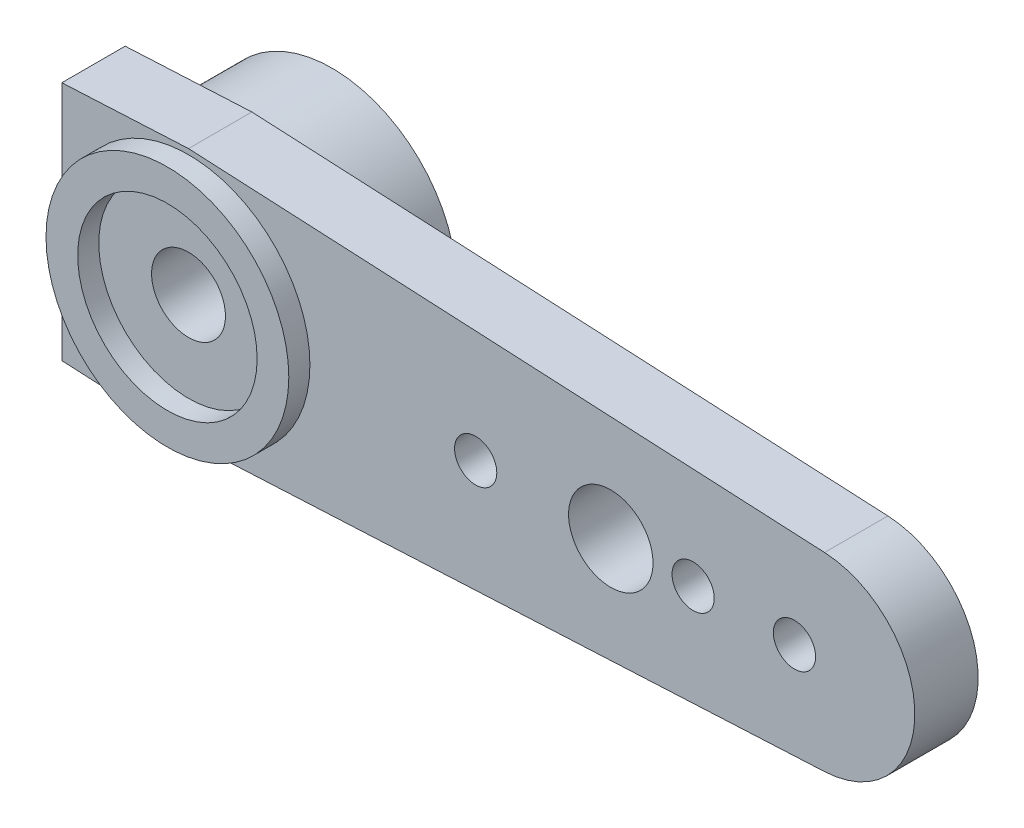
ISO-10303-21;
HEADER;
FILE_DESCRIPTION(('STEP AP214'),'2;1');
FILE_NAME('part.step','',(''),(''),'','','');
FILE_SCHEMA(('AUTOMOTIVE_DESIGN { 1 0 10303 214 1 1 1 1 }'));
ENDSEC;
DATA;
#1=APPLICATION_CONTEXT('core data for automotive mechanical design processes');
#2=APPLICATION_PROTOCOL_DEFINITION('international standard','automotive_design',2000,#1);
#3=PRODUCT_CONTEXT('',#1,'mechanical');
#4=PRODUCT('Part','Part','',(#3));
#5=PRODUCT_RELATED_PRODUCT_CATEGORY('part','',(#4));
#6=PRODUCT_DEFINITION_FORMATION('','',#4);
#7=PRODUCT_DEFINITION_CONTEXT('part definition',#1,'design');
#8=PRODUCT_DEFINITION('design','',#6,#7);
#9=PRODUCT_DEFINITION_SHAPE('','',#8);
#10=(LENGTH_UNIT() NAMED_UNIT(*) SI_UNIT(.MILLI.,.METRE.));
#11=(NAMED_UNIT(*) PLANE_ANGLE_UNIT() SI_UNIT($,.RADIAN.));
#12=(NAMED_UNIT(*) SI_UNIT($,.STERADIAN.) SOLID_ANGLE_UNIT());
#13=UNCERTAINTY_MEASURE_WITH_UNIT(LENGTH_MEASURE(1.E-05),#10,'distance_accuracy_value','');
#14=(GEOMETRIC_REPRESENTATION_CONTEXT(3) GLOBAL_UNCERTAINTY_ASSIGNED_CONTEXT((#13)) GLOBAL_UNIT_ASSIGNED_CONTEXT((#10,
#11,#12)) REPRESENTATION_CONTEXT('',''));
#15=CARTESIAN_POINT('',(0.,0.,0.));
#16=DIRECTION('',(0.,0.,1.));
#17=DIRECTION('',(1.,0.,0.));
#18=AXIS2_PLACEMENT_3D('',#15,#16,#17);
#19=CARTESIAN_POINT('',(14.95,0.,3.4));
#20=DIRECTION('',(0.,0.,1.));
#21=DIRECTION('',(1.,0.,0.));
#22=AXIS2_PLACEMENT_3D('',#19,#20,#21);
#23=PLANE('',#22);
#24=CARTESIAN_POINT('',(0.,0.,3.4));
#25=DIRECTION('',(0.,0.,1.));
#26=DIRECTION('',(1.,0.,0.));
#27=AXIS2_PLACEMENT_3D('',#24,#25,#26);
#28=CIRCLE('',#27,0.875);
#29=CARTESIAN_POINT('',(0.875,0.,3.4));
#30=VERTEX_POINT('',#29);
#31=EDGE_CURVE('E119',#30,#30,#28,.T.);
#32=ORIENTED_EDGE('',*,*,#31,.F.);
#33=EDGE_LOOP('',(#32));
#34=FACE_BOUND('',#33,.T.);
#35=CARTESIAN_POINT('',(0.,0.,3.4));
#36=DIRECTION('',(0.,0.,1.));
#37=DIRECTION('',(1.,0.,0.));
#38=AXIS2_PLACEMENT_3D('',#35,#36,#37);
#39=CIRCLE('',#38,2.125);
#40=CARTESIAN_POINT('',(2.125,0.,3.4));
#41=VERTEX_POINT('',#40);
#42=EDGE_CURVE('E40',#41,#41,#39,.F.);
#43=ORIENTED_EDGE('',*,*,#42,.F.);
#44=EDGE_LOOP('',(#43));
#45=FACE_BOUND('',#44,.T.);
#46=ADVANCED_FACE('F32',(#34,#45),#23,.T.);
#47=CARTESIAN_POINT('',(0.,0.,0.));
#48=DIRECTION('',(0.,0.,1.));
#49=DIRECTION('',(1.,0.,0.));
#50=AXIS2_PLACEMENT_3D('',#47,#48,#49);
#51=PLANE('',#50);
#52=CARTESIAN_POINT('',(0.,0.,0.));
#53=DIRECTION('',(0.,0.,1.));
#54=DIRECTION('',(1.,0.,0.));
#55=AXIS2_PLACEMENT_3D('',#52,#53,#54);
#56=CIRCLE('',#55,2.95);
#57=CARTESIAN_POINT('',(-2.95,0.,0.));
#58=VERTEX_POINT('',#57);
#59=EDGE_CURVE('E141',#58,#58,#56,.T.);
#60=ORIENTED_EDGE('',*,*,#59,.F.);
#61=EDGE_LOOP('',(#60));
#62=FACE_BOUND('',#61,.T.);
#63=CARTESIAN_POINT('',(0.,0.,0.));
#64=DIRECTION('',(0.,0.,1.));
#65=DIRECTION('',(1.,0.,0.));
#66=AXIS2_PLACEMENT_3D('',#63,#64,#65);
#67=CIRCLE('',#66,2.25);
#68=CARTESIAN_POINT('',(-2.25,0.,0.));
#69=VERTEX_POINT('',#68);
#70=EDGE_CURVE('E138',#69,#69,#67,.T.);
#71=ORIENTED_EDGE('',*,*,#70,.T.);
#72=EDGE_LOOP('',(#71));
#73=FACE_BOUND('',#72,.T.);
#74=ADVANCED_FACE('F216',(#62,#73),#51,.F.);
#75=CARTESIAN_POINT('',(0.,0.,1.9));
#76=DIRECTION('',(0.,0.,-1.));
#77=DIRECTION('',(-1.,0.,0.));
#78=AXIS2_PLACEMENT_3D('',#75,#76,#77);
#79=CYLINDRICAL_SURFACE('',#78,2.95);
#80=CARTESIAN_POINT('',(0.,0.,1.9));
#81=DIRECTION('',(0.,0.,1.));
#82=DIRECTION('',(1.,0.,0.));
#83=AXIS2_PLACEMENT_3D('',#80,#81,#82);
#84=CIRCLE('',#83,2.95);
#85=CARTESIAN_POINT('',(-2.95,0.,1.9));
#86=VERTEX_POINT('',#85);
#87=EDGE_CURVE('E142',#86,#86,#84,.T.);
#88=CARTESIAN_POINT('',(-2.95,0.,1.9));
#89=CARTESIAN_POINT('',(-2.95,0.,1.88020833333333));
#90=CARTESIAN_POINT('',(-2.95,0.,1.86041666666667));
#91=CARTESIAN_POINT('',(-2.95,0.,1.82083333333333));
#92=CARTESIAN_POINT('',(-2.95,0.,1.80104166666667));
#93=CARTESIAN_POINT('',(-2.95,0.,1.76145833333333));
#94=CARTESIAN_POINT('',(-2.95,0.,1.74166666666667));
#95=CARTESIAN_POINT('',(-2.95,0.,1.70208333333333));
#96=CARTESIAN_POINT('',(-2.95,0.,1.68229166666667));
#97=CARTESIAN_POINT('',(-2.95,0.,1.64270833333333));
#98=CARTESIAN_POINT('',(-2.95,0.,1.62291666666667));
#99=CARTESIAN_POINT('',(-2.95,0.,1.58333333333333));
#100=CARTESIAN_POINT('',(-2.95,0.,1.56354166666667));
#101=CARTESIAN_POINT('',(-2.95,0.,1.52395833333333));
#102=CARTESIAN_POINT('',(-2.95,0.,1.50416666666667));
#103=CARTESIAN_POINT('',(-2.95,0.,1.46458333333333));
#104=CARTESIAN_POINT('',(-2.95,0.,1.44479166666667));
#105=CARTESIAN_POINT('',(-2.95,0.,1.40520833333333));
#106=CARTESIAN_POINT('',(-2.95,0.,1.38541666666667));
#107=CARTESIAN_POINT('',(-2.95,0.,1.34583333333333));
#108=CARTESIAN_POINT('',(-2.95,0.,1.32604166666667));
#109=CARTESIAN_POINT('',(-2.95,0.,1.28645833333333));
#110=CARTESIAN_POINT('',(-2.95,0.,1.26666666666667));
#111=CARTESIAN_POINT('',(-2.95,0.,1.22708333333333));
#112=CARTESIAN_POINT('',(-2.95,0.,1.20729166666667));
#113=CARTESIAN_POINT('',(-2.95,0.,1.16770833333333));
#114=CARTESIAN_POINT('',(-2.95,0.,1.14791666666667));
#115=CARTESIAN_POINT('',(-2.95,0.,1.10833333333333));
#116=CARTESIAN_POINT('',(-2.95,0.,1.08854166666667));
#117=CARTESIAN_POINT('',(-2.95,0.,1.04895833333333));
#118=CARTESIAN_POINT('',(-2.95,0.,1.02916666666667));
#119=CARTESIAN_POINT('',(-2.95,0.,0.989583333333333));
#120=CARTESIAN_POINT('',(-2.95,0.,0.969791666666667));
#121=CARTESIAN_POINT('',(-2.95,0.,0.930208333333333));
#122=CARTESIAN_POINT('',(-2.95,0.,0.910416666666667));
#123=CARTESIAN_POINT('',(-2.95,0.,0.870833333333333));
#124=CARTESIAN_POINT('',(-2.95,0.,0.851041666666667));
#125=CARTESIAN_POINT('',(-2.95,0.,0.811458333333333));
#126=CARTESIAN_POINT('',(-2.95,0.,0.791666666666667));
#127=CARTESIAN_POINT('',(-2.95,0.,0.752083333333333));
#128=CARTESIAN_POINT('',(-2.95,0.,0.732291666666667));
#129=CARTESIAN_POINT('',(-2.95,0.,0.692708333333333));
#130=CARTESIAN_POINT('',(-2.95,0.,0.672916666666667));
#131=CARTESIAN_POINT('',(-2.95,0.,0.633333333333333));
#132=CARTESIAN_POINT('',(-2.95,0.,0.613541666666667));
#133=CARTESIAN_POINT('',(-2.95,0.,0.573958333333333));
#134=CARTESIAN_POINT('',(-2.95,0.,0.554166666666667));
#135=CARTESIAN_POINT('',(-2.95,0.,0.514583333333333));
#136=CARTESIAN_POINT('',(-2.95,0.,0.494791666666667));
#137=CARTESIAN_POINT('',(-2.95,0.,0.455208333333333));
#138=CARTESIAN_POINT('',(-2.95,0.,0.435416666666667));
#139=CARTESIAN_POINT('',(-2.95,0.,0.395833333333333));
#140=CARTESIAN_POINT('',(-2.95,0.,0.376041666666667));
#141=CARTESIAN_POINT('',(-2.95,0.,0.336458333333333));
#142=CARTESIAN_POINT('',(-2.95,0.,0.316666666666667));
#143=CARTESIAN_POINT('',(-2.95,0.,0.277083333333333));
#144=CARTESIAN_POINT('',(-2.95,0.,0.257291666666667));
#145=CARTESIAN_POINT('',(-2.95,0.,0.217708333333333));
#146=CARTESIAN_POINT('',(-2.95,0.,0.197916666666667));
#147=CARTESIAN_POINT('',(-2.95,0.,0.158333333333333));
#148=CARTESIAN_POINT('',(-2.95,0.,0.138541666666667));
#149=CARTESIAN_POINT('',(-2.95,0.,0.0989583333333333));
#150=CARTESIAN_POINT('',(-2.95,0.,0.0791666666666666));
#151=CARTESIAN_POINT('',(-2.95,0.,0.0395833333333333));
#152=CARTESIAN_POINT('',(-2.95,0.,0.0197916666666666));
#153=CARTESIAN_POINT('',(-2.95,0.,0.));
#154=B_SPLINE_CURVE_WITH_KNOTS('',3,(#88,#89,#90,#91,#92,#93,#94,#95,#96,#97,#98,#99,#100,#101,
#102,#103,#104,#105,#106,#107,#108,#109,#110,#111,#112,#113,#114,#115,#116,#117,#118,#119,#120,
#121,#122,#123,#124,#125,#126,#127,#128,#129,#130,#131,#132,#133,#134,#135,#136,#137,#138,#139,
#140,#141,#142,#143,#144,#145,#146,#147,#148,#149,#150,#151,#152,#153),.UNSPECIFIED.,.F.,.F.,(4,
2,2,2,2,2,2,2,2,2,2,2,2,2,2,2,2,2,2,2,2,2,2,2,2,2,2,2,2,2,2,2,4),(0.,0.059375,0.11875,0.178125,
0.2375,0.296875,0.35625,0.415625,0.475,0.534375,0.59375,0.653125,0.7125,0.771875,0.83125,
0.890625,0.95,1.009375,1.06875,1.128125,1.1875,1.246875,1.30625,1.365625,1.425,1.484375,1.54375,
1.603125,1.6625,1.721875,1.78125,1.840625,1.9),.UNSPECIFIED.);
#155=EDGE_CURVE('BSEAM34',#86,#58,#154,.T.);
#156=ORIENTED_EDGE('',*,*,#87,.F.);
#157=ORIENTED_EDGE('',*,*,#59,.T.);
#158=ORIENTED_EDGE('',*,*,#155,.T.);
#159=ORIENTED_EDGE('',*,*,#155,.F.);
#160=EDGE_LOOP('',(#156,#158,#157,#159));
#161=FACE_BOUND('',#160,.T.);
#162=ADVANCED_FACE('F34',(#161),#79,.T.);
#163=CARTESIAN_POINT('',(0.,0.,1.9));
#164=DIRECTION('',(0.,0.,-1.));
#165=DIRECTION('',(-1.,0.,0.));
#166=AXIS2_PLACEMENT_3D('',#163,#164,#165);
#167=CYLINDRICAL_SURFACE('',#166,2.25);
#168=CARTESIAN_POINT('',(0.,0.,1.9));
#169=DIRECTION('',(0.,0.,1.));
#170=DIRECTION('',(1.,0.,0.));
#171=AXIS2_PLACEMENT_3D('',#168,#169,#170);
#172=CIRCLE('',#171,2.25);
#173=CARTESIAN_POINT('',(-2.25,0.,1.9));
#174=VERTEX_POINT('',#173);
#175=EDGE_CURVE('E135',#174,#174,#172,.T.);
#176=CARTESIAN_POINT('',(-2.25,0.,1.9));
#177=CARTESIAN_POINT('',(-2.25,0.,1.88020833333333));
#178=CARTESIAN_POINT('',(-2.25,0.,1.86041666666667));
#179=CARTESIAN_POINT('',(-2.25,0.,1.82083333333333));
#180=CARTESIAN_POINT('',(-2.25,0.,1.80104166666667));
#181=CARTESIAN_POINT('',(-2.25,0.,1.76145833333333));
#182=CARTESIAN_POINT('',(-2.25,0.,1.74166666666667));
#183=CARTESIAN_POINT('',(-2.25,0.,1.70208333333333));
#184=CARTESIAN_POINT('',(-2.25,0.,1.68229166666667));
#185=CARTESIAN_POINT('',(-2.25,0.,1.64270833333333));
#186=CARTESIAN_POINT('',(-2.25,0.,1.62291666666667));
#187=CARTESIAN_POINT('',(-2.25,0.,1.58333333333333));
#188=CARTESIAN_POINT('',(-2.25,0.,1.56354166666667));
#189=CARTESIAN_POINT('',(-2.25,0.,1.52395833333333));
#190=CARTESIAN_POINT('',(-2.25,0.,1.50416666666667));
#191=CARTESIAN_POINT('',(-2.25,0.,1.46458333333333));
#192=CARTESIAN_POINT('',(-2.25,0.,1.44479166666667));
#193=CARTESIAN_POINT('',(-2.25,0.,1.40520833333333));
#194=CARTESIAN_POINT('',(-2.25,0.,1.38541666666667));
#195=CARTESIAN_POINT('',(-2.25,0.,1.34583333333333));
#196=CARTESIAN_POINT('',(-2.25,0.,1.32604166666667));
#197=CARTESIAN_POINT('',(-2.25,0.,1.28645833333333));
#198=CARTESIAN_POINT('',(-2.25,0.,1.26666666666667));
#199=CARTESIAN_POINT('',(-2.25,0.,1.22708333333333));
#200=CARTESIAN_POINT('',(-2.25,0.,1.20729166666667));
#201=CARTESIAN_POINT('',(-2.25,0.,1.16770833333333));
#202=CARTESIAN_POINT('',(-2.25,0.,1.14791666666667));
#203=CARTESIAN_POINT('',(-2.25,0.,1.10833333333333));
#204=CARTESIAN_POINT('',(-2.25,0.,1.08854166666667));
#205=CARTESIAN_POINT('',(-2.25,0.,1.04895833333333));
#206=CARTESIAN_POINT('',(-2.25,0.,1.02916666666667));
#207=CARTESIAN_POINT('',(-2.25,0.,0.989583333333333));
#208=CARTESIAN_POINT('',(-2.25,0.,0.969791666666667));
#209=CARTESIAN_POINT('',(-2.25,0.,0.930208333333333));
#210=CARTESIAN_POINT('',(-2.25,0.,0.910416666666667));
#211=CARTESIAN_POINT('',(-2.25,0.,0.870833333333333));
#212=CARTESIAN_POINT('',(-2.25,0.,0.851041666666667));
#213=CARTESIAN_POINT('',(-2.25,0.,0.811458333333333));
#214=CARTESIAN_POINT('',(-2.25,0.,0.791666666666667));
#215=CARTESIAN_POINT('',(-2.25,0.,0.752083333333333));
#216=CARTESIAN_POINT('',(-2.25,0.,0.732291666666667));
#217=CARTESIAN_POINT('',(-2.25,0.,0.692708333333333));
#218=CARTESIAN_POINT('',(-2.25,0.,0.672916666666667));
#219=CARTESIAN_POINT('',(-2.25,0.,0.633333333333333));
#220=CARTESIAN_POINT('',(-2.25,0.,0.613541666666667));
#221=CARTESIAN_POINT('',(-2.25,0.,0.573958333333333));
#222=CARTESIAN_POINT('',(-2.25,0.,0.554166666666667));
#223=CARTESIAN_POINT('',(-2.25,0.,0.514583333333333));
#224=CARTESIAN_POINT('',(-2.25,0.,0.494791666666667));
#225=CARTESIAN_POINT('',(-2.25,0.,0.455208333333333));
#226=CARTESIAN_POINT('',(-2.25,0.,0.435416666666667));
#227=CARTESIAN_POINT('',(-2.25,0.,0.395833333333333));
#228=CARTESIAN_POINT('',(-2.25,0.,0.376041666666667));
#229=CARTESIAN_POINT('',(-2.25,0.,0.336458333333333));
#230=CARTESIAN_POINT('',(-2.25,0.,0.316666666666667));
#231=CARTESIAN_POINT('',(-2.25,0.,0.277083333333333));
#232=CARTESIAN_POINT('',(-2.25,0.,0.257291666666667));
#233=CARTESIAN_POINT('',(-2.25,0.,0.217708333333333));
#234=CARTESIAN_POINT('',(-2.25,0.,0.197916666666667));
#235=CARTESIAN_POINT('',(-2.25,0.,0.158333333333333));
#236=CARTESIAN_POINT('',(-2.25,0.,0.138541666666667));
#237=CARTESIAN_POINT('',(-2.25,0.,0.0989583333333333));
#238=CARTESIAN_POINT('',(-2.25,0.,0.0791666666666666));
#239=CARTESIAN_POINT('',(-2.25,0.,0.0395833333333333));
#240=CARTESIAN_POINT('',(-2.25,0.,0.0197916666666666));
#241=CARTESIAN_POINT('',(-2.25,0.,0.));
#242=B_SPLINE_CURVE_WITH_KNOTS('',3,(#176,#177,#178,#179,#180,#181,#182,#183,#184,#185,#186,
#187,#188,#189,#190,#191,#192,#193,#194,#195,#196,#197,#198,#199,#200,#201,#202,#203,#204,#205,
#206,#207,#208,#209,#210,#211,#212,#213,#214,#215,#216,#217,#218,#219,#220,#221,#222,#223,#224,
#225,#226,#227,#228,#229,#230,#231,#232,#233,#234,#235,#236,#237,#238,#239,#240,#241),
.UNSPECIFIED.,.F.,.F.,(4,2,2,2,2,2,2,2,2,2,2,2,2,2,2,2,2,2,2,2,2,2,2,2,2,2,2,2,2,2,2,2,4),(0.,
0.059375,0.11875,0.178125,0.2375,0.296875,0.35625,0.415625,0.475,0.534375,0.59375,0.653125,
0.7125,0.771875,0.83125,0.890625,0.95,1.009375,1.06875,1.128125,1.1875,1.246875,1.30625,
1.365625,1.425,1.484375,1.54375,1.603125,1.6625,1.721875,1.78125,1.840625,1.9),.UNSPECIFIED.);
#243=EDGE_CURVE('BSEAM230',#174,#69,#242,.T.);
#244=ORIENTED_EDGE('',*,*,#175,.T.);
#245=ORIENTED_EDGE('',*,*,#70,.F.);
#246=ORIENTED_EDGE('',*,*,#243,.T.);
#247=ORIENTED_EDGE('',*,*,#243,.F.);
#248=EDGE_LOOP('',(#244,#246,#245,#247));
#249=FACE_BOUND('',#248,.T.);
#250=ADVANCED_FACE('F230',(#249),#167,.F.);
#251=CARTESIAN_POINT('',(14.95,0.,1.9));
#252=DIRECTION('',(0.,0.,1.));
#253=DIRECTION('',(1.,0.,0.));
#254=AXIS2_PLACEMENT_3D('',#251,#252,#253);
#255=PLANE('',#254);
#256=CARTESIAN_POINT('',(0.,0.,1.9));
#257=DIRECTION('',(0.,0.,1.));
#258=DIRECTION('',(1.,0.,0.));
#259=AXIS2_PLACEMENT_3D('',#256,#257,#258);
#260=CIRCLE('',#259,0.875);
#261=CARTESIAN_POINT('',(0.875,0.,1.9));
#262=VERTEX_POINT('',#261);
#263=EDGE_CURVE('E185',#262,#262,#260,.T.);
#264=ORIENTED_EDGE('',*,*,#263,.T.);
#265=EDGE_LOOP('',(#264));
#266=FACE_BOUND('',#265,.T.);
#267=ORIENTED_EDGE('',*,*,#175,.F.);
#268=EDGE_LOOP('',(#267));
#269=FACE_BOUND('',#268,.T.);
#270=ADVANCED_FACE('F213',(#266,#269),#255,.F.);
#271=DIRECTION('',(0.,1.,0.));
#272=VECTOR('',#271,1.);
#273=CARTESIAN_POINT('',(-3.,2.85006189166887,3.4));
#274=LINE('',#273,#272);
#275=CARTESIAN_POINT('',(-3.,-2.85006189166887,3.4));
#276=VERTEX_POINT('',#275);
#277=CARTESIAN_POINT('',(-3.,2.85006189166887,3.4));
#278=VERTEX_POINT('',#277);
#279=EDGE_CURVE('E93',#276,#278,#274,.T.);
#280=ORIENTED_EDGE('',*,*,#279,.F.);
#281=DIRECTION('',(0.998753366339054,-0.0499170634794085,0.));
#282=VECTOR('',#281,1.);
#283=CARTESIAN_POINT('',(-15.0623133928287,-2.24719507426287,3.4));
#284=LINE('',#283,#282);
#285=CARTESIAN_POINT('',(0.,-3.,3.4));
#286=VERTEX_POINT('',#285);
#287=EDGE_CURVE('E101',#276,#286,#284,.T.);
#288=ORIENTED_EDGE('',*,*,#287,.T.);
#289=DIRECTION('',(0.998753366339054,0.0499170634794085,0.));
#290=VECTOR('',#289,1.);
#291=CARTESIAN_POINT('',(15.0623133928287,-2.24719507426287,3.4));
#292=LINE('',#291,#290);
#293=CARTESIAN_POINT('',(15.0623133928287,-2.24719507426287,3.4));
#294=VERTEX_POINT('',#293);
#295=EDGE_CURVE('E55',#286,#294,#292,.T.);
#296=ORIENTED_EDGE('',*,*,#295,.T.);
#297=CARTESIAN_POINT('',(14.95,0.,3.4));
#298=DIRECTION('',(0.,0.,1.));
#299=DIRECTION('',(1.,0.,0.));
#300=AXIS2_PLACEMENT_3D('',#297,#298,#299);
#301=CIRCLE('',#300,2.25);
#302=CARTESIAN_POINT('',(15.0623133928287,2.24719507426287,3.4));
#303=VERTEX_POINT('',#302);
#304=EDGE_CURVE('E127',#294,#303,#301,.T.);
#305=ORIENTED_EDGE('',*,*,#304,.T.);
#306=DIRECTION('',(-0.998753366339054,0.0499170634794085,0.));
#307=VECTOR('',#306,1.);
#308=CARTESIAN_POINT('',(15.0623133928287,2.24719507426287,3.4));
#309=LINE('',#308,#307);
#310=CARTESIAN_POINT('',(0.,3.,3.4));
#311=VERTEX_POINT('',#310);
#312=EDGE_CURVE('E84',#303,#311,#309,.T.);
#313=ORIENTED_EDGE('',*,*,#312,.T.);
#314=DIRECTION('',(-0.998753366339054,-0.0499170634794085,0.));
#315=VECTOR('',#314,1.);
#316=CARTESIAN_POINT('',(-15.0623133928287,2.24719507426287,3.4));
#317=LINE('',#316,#315);
#318=EDGE_CURVE('E104',#311,#278,#317,.T.);
#319=ORIENTED_EDGE('',*,*,#318,.T.);
#320=EDGE_LOOP('',(#280,#288,#296,#305,#313,#319));
#321=FACE_BOUND('',#320,.T.);
#322=CARTESIAN_POINT('',(10.,0.,3.4));
#323=DIRECTION('',(0.,0.,1.));
#324=DIRECTION('',(1.,0.,0.));
#325=AXIS2_PLACEMENT_3D('',#322,#323,#324);
#326=CIRCLE('',#325,1.);
#327=CARTESIAN_POINT('',(11.,0.,3.4));
#328=VERTEX_POINT('',#327);
#329=EDGE_CURVE('E151',#328,#328,#326,.T.);
#330=ORIENTED_EDGE('',*,*,#329,.F.);
#331=EDGE_LOOP('',(#330));
#332=FACE_BOUND('',#331,.T.);
#333=CARTESIAN_POINT('',(0.,0.,3.4));
#334=DIRECTION('',(0.,0.,1.));
#335=DIRECTION('',(1.,0.,0.));
#336=AXIS2_PLACEMENT_3D('',#333,#334,#335);
#337=CIRCLE('',#336,2.875);
#338=CARTESIAN_POINT('',(2.875,0.,3.4));
#339=VERTEX_POINT('',#338);
#340=EDGE_CURVE('E155',#339,#339,#337,.T.);
#341=ORIENTED_EDGE('',*,*,#340,.F.);
#342=EDGE_LOOP('',(#341));
#343=FACE_BOUND('',#342,.T.);
#344=CARTESIAN_POINT('',(11.95,0.,3.4));
#345=DIRECTION('',(0.,0.,1.));
#346=DIRECTION('',(1.,0.,0.));
#347=AXIS2_PLACEMENT_3D('',#344,#345,#346);
#348=CIRCLE('',#347,0.500000000000001);
#349=CARTESIAN_POINT('',(12.45,0.,3.4));
#350=VERTEX_POINT('',#349);
#351=EDGE_CURVE('E176',#350,#350,#348,.T.);
#352=ORIENTED_EDGE('',*,*,#351,.F.);
#353=EDGE_LOOP('',(#352));
#354=FACE_BOUND('',#353,.T.);
#355=CARTESIAN_POINT('',(6.8,0.,3.4));
#356=DIRECTION('',(0.,0.,1.));
#357=DIRECTION('',(1.,0.,0.));
#358=AXIS2_PLACEMENT_3D('',#355,#356,#357);
#359=CIRCLE('',#358,0.500000000000001);
#360=CARTESIAN_POINT('',(7.3,0.,3.4));
#361=VERTEX_POINT('',#360);
#362=EDGE_CURVE('E182',#361,#361,#359,.T.);
#363=ORIENTED_EDGE('',*,*,#362,.F.);
#364=EDGE_LOOP('',(#363));
#365=FACE_BOUND('',#364,.T.);
#366=CARTESIAN_POINT('',(14.35,0.,3.4));
#367=DIRECTION('',(0.,0.,1.));
#368=DIRECTION('',(1.,0.,0.));
#369=AXIS2_PLACEMENT_3D('',#366,#367,#368);
#370=CIRCLE('',#369,0.500000000000001);
#371=CARTESIAN_POINT('',(14.85,0.,3.4));
#372=VERTEX_POINT('',#371);
#373=EDGE_CURVE('E170',#372,#372,#370,.T.);
#374=ORIENTED_EDGE('',*,*,#373,.F.);
#375=EDGE_LOOP('',(#374));
#376=FACE_BOUND('',#375,.T.);
#377=ADVANCED_FACE('F99',(#321,#332,#343,#354,#365,#376),#23,.T.);
#378=CARTESIAN_POINT('',(10.,0.,1.9));
#379=DIRECTION('',(0.,0.,1.));
#380=DIRECTION('',(1.,0.,0.));
#381=AXIS2_PLACEMENT_3D('',#378,#379,#380);
#382=CIRCLE('',#381,1.);
#383=CARTESIAN_POINT('',(11.,0.,1.9));
#384=VERTEX_POINT('',#383);
#385=EDGE_CURVE('E148',#384,#384,#382,.T.);
#386=ORIENTED_EDGE('',*,*,#385,.T.);
#387=EDGE_LOOP('',(#386));
#388=FACE_BOUND('',#387,.T.);
#389=ORIENTED_EDGE('',*,*,#87,.T.);
#390=EDGE_LOOP('',(#389));
#391=FACE_BOUND('',#390,.T.);
#392=DIRECTION('',(0.998753366339054,-0.0499170634794085,0.));
#393=VECTOR('',#392,1.);
#394=CARTESIAN_POINT('',(-15.0623133928287,-2.24719507426287,1.9));
#395=LINE('',#394,#393);
#396=CARTESIAN_POINT('',(-3.,-2.85006189166887,1.9));
#397=VERTEX_POINT('',#396);
#398=CARTESIAN_POINT('',(0.,-3.,1.9));
#399=VERTEX_POINT('',#398);
#400=EDGE_CURVE('E124',#397,#399,#395,.T.);
#401=ORIENTED_EDGE('',*,*,#400,.F.);
#402=DIRECTION('',(0.,1.,0.));
#403=VECTOR('',#402,1.);
#404=CARTESIAN_POINT('',(-3.,0.,1.9));
#405=LINE('',#404,#403);
#406=CARTESIAN_POINT('',(-3.,2.85006189166887,1.9));
#407=VERTEX_POINT('',#406);
#408=EDGE_CURVE('E47',#397,#407,#405,.T.);
#409=ORIENTED_EDGE('',*,*,#408,.T.);
#410=DIRECTION('',(-0.998753366339054,-0.0499170634794085,0.));
#411=VECTOR('',#410,1.);
#412=CARTESIAN_POINT('',(-15.0623133928287,2.24719507426287,1.9));
#413=LINE('',#412,#411);
#414=CARTESIAN_POINT('',(0.,3.,1.9));
#415=VERTEX_POINT('',#414);
#416=EDGE_CURVE('E121',#415,#407,#413,.T.);
#417=ORIENTED_EDGE('',*,*,#416,.F.);
#418=DIRECTION('',(-0.998753366339054,0.0499170634794085,0.));
#419=VECTOR('',#418,1.);
#420=CARTESIAN_POINT('',(15.0623133928287,2.24719507426287,1.9));
#421=LINE('',#420,#419);
#422=CARTESIAN_POINT('',(15.0623133928287,2.24719507426287,1.9));
#423=VERTEX_POINT('',#422);
#424=EDGE_CURVE('E118',#423,#415,#421,.T.);
#425=ORIENTED_EDGE('',*,*,#424,.F.);
#426=CARTESIAN_POINT('',(14.95,0.,1.9));
#427=DIRECTION('',(0.,0.,1.));
#428=DIRECTION('',(1.,0.,0.));
#429=AXIS2_PLACEMENT_3D('',#426,#427,#428);
#430=CIRCLE('',#429,2.25);
#431=CARTESIAN_POINT('',(15.0623133928287,-2.24719507426287,1.9));
#432=VERTEX_POINT('',#431);
#433=EDGE_CURVE('E115',#432,#423,#430,.T.);
#434=ORIENTED_EDGE('',*,*,#433,.F.);
#435=DIRECTION('',(0.998753366339054,0.0499170634794085,0.));
#436=VECTOR('',#435,1.);
#437=CARTESIAN_POINT('',(15.0623133928287,-2.24719507426287,1.9));
#438=LINE('',#437,#436);
#439=EDGE_CURVE('E76',#399,#432,#438,.T.);
#440=ORIENTED_EDGE('',*,*,#439,.F.);
#441=EDGE_LOOP('',(#401,#409,#417,#425,#434,#440));
#442=FACE_BOUND('',#441,.T.);
#443=CARTESIAN_POINT('',(6.8,0.,1.9));
#444=DIRECTION('',(0.,0.,1.));
#445=DIRECTION('',(1.,0.,0.));
#446=AXIS2_PLACEMENT_3D('',#443,#444,#445);
#447=CIRCLE('',#446,0.500000000000001);
#448=CARTESIAN_POINT('',(7.3,0.,1.9));
#449=VERTEX_POINT('',#448);
#450=EDGE_CURVE('E179',#449,#449,#447,.T.);
#451=ORIENTED_EDGE('',*,*,#450,.T.);
#452=EDGE_LOOP('',(#451));
#453=FACE_BOUND('',#452,.T.);
#454=CARTESIAN_POINT('',(11.95,0.,1.9));
#455=DIRECTION('',(0.,0.,1.));
#456=DIRECTION('',(1.,0.,0.));
#457=AXIS2_PLACEMENT_3D('',#454,#455,#456);
#458=CIRCLE('',#457,0.500000000000001);
#459=CARTESIAN_POINT('',(12.45,0.,1.9));
#460=VERTEX_POINT('',#459);
#461=EDGE_CURVE('E173',#460,#460,#458,.T.);
#462=ORIENTED_EDGE('',*,*,#461,.T.);
#463=EDGE_LOOP('',(#462));
#464=FACE_BOUND('',#463,.T.);
#465=CARTESIAN_POINT('',(14.35,0.,1.9));
#466=DIRECTION('',(0.,0.,1.));
#467=DIRECTION('',(1.,0.,0.));
#468=AXIS2_PLACEMENT_3D('',#465,#466,#467);
#469=CIRCLE('',#468,0.500000000000001);
#470=CARTESIAN_POINT('',(14.85,0.,1.9));
#471=VERTEX_POINT('',#470);
#472=EDGE_CURVE('E167',#471,#471,#469,.T.);
#473=ORIENTED_EDGE('',*,*,#472,.T.);
#474=EDGE_LOOP('',(#473));
#475=FACE_BOUND('',#474,.T.);
#476=ADVANCED_FACE('F199',(#388,#391,#442,#453,#464,#475),#255,.F.);
#477=CARTESIAN_POINT('',(14.95,0.,3.4));
#478=DIRECTION('',(0.,0.,-1.));
#479=DIRECTION('',(-1.,0.,0.));
#480=AXIS2_PLACEMENT_3D('',#477,#478,#479);
#481=CYLINDRICAL_SURFACE('',#480,2.25);
#482=ORIENTED_EDGE('',*,*,#433,.T.);
#483=DIRECTION('',(0.,0.,-1.));
#484=VECTOR('',#483,1.);
#485=CARTESIAN_POINT('',(15.0623133928287,2.24719507426287,3.4));
#486=LINE('',#485,#484);
#487=EDGE_CURVE('E133',#303,#423,#486,.T.);
#488=ORIENTED_EDGE('',*,*,#487,.F.);
#489=ORIENTED_EDGE('',*,*,#304,.F.);
#490=DIRECTION('',(0.,0.,-1.));
#491=VECTOR('',#490,1.);
#492=CARTESIAN_POINT('',(15.0623133928287,-2.24719507426287,3.4));
#493=LINE('',#492,#491);
#494=EDGE_CURVE('E110',#294,#432,#493,.T.);
#495=ORIENTED_EDGE('',*,*,#494,.T.);
#496=EDGE_LOOP('',(#482,#488,#489,#495));
#497=FACE_BOUND('',#496,.T.);
#498=ADVANCED_FACE('F204',(#497),#481,.T.);
#499=CARTESIAN_POINT('',(15.0623133928287,2.24719507426287,3.4));
#500=DIRECTION('',(-0.0499170634794085,-0.998753366339054,0.));
#501=DIRECTION('',(0.998753366339054,-0.0499170634794085,0.));
#502=AXIS2_PLACEMENT_3D('',#499,#500,#501);
#503=PLANE('',#502);
#504=ORIENTED_EDGE('',*,*,#424,.T.);
#505=DIRECTION('',(0.,0.,-1.));
#506=VECTOR('',#505,1.);
#507=CARTESIAN_POINT('',(0.,3.,3.4));
#508=LINE('',#507,#506);
#509=EDGE_CURVE('E130',#311,#415,#508,.T.);
#510=ORIENTED_EDGE('',*,*,#509,.F.);
#511=ORIENTED_EDGE('',*,*,#312,.F.);
#512=ORIENTED_EDGE('',*,*,#487,.T.);
#513=EDGE_LOOP('',(#504,#510,#511,#512));
#514=FACE_BOUND('',#513,.T.);
#515=ADVANCED_FACE('F194',(#514),#503,.F.);
#516=CARTESIAN_POINT('',(-15.0623133928287,2.24719507426287,3.4));
#517=DIRECTION('',(0.0499170634794085,-0.998753366339054,0.));
#518=DIRECTION('',(0.998753366339054,0.0499170634794085,0.));
#519=AXIS2_PLACEMENT_3D('',#516,#517,#518);
#520=PLANE('',#519);
#521=ORIENTED_EDGE('',*,*,#416,.T.);
#522=DIRECTION('',(0.,0.,1.));
#523=VECTOR('',#522,1.);
#524=CARTESIAN_POINT('',(-3.,2.85006189166887,0.));
#525=LINE('',#524,#523);
#526=EDGE_CURVE('E105',#407,#278,#525,.T.);
#527=ORIENTED_EDGE('',*,*,#526,.T.);
#528=ORIENTED_EDGE('',*,*,#318,.F.);
#529=ORIENTED_EDGE('',*,*,#509,.T.);
#530=EDGE_LOOP('',(#521,#527,#528,#529));
#531=FACE_BOUND('',#530,.T.);
#532=ADVANCED_FACE('F197',(#531),#520,.F.);
#533=CARTESIAN_POINT('',(-15.0623133928287,-2.24719507426287,3.4));
#534=DIRECTION('',(0.0499170634794085,0.998753366339054,0.));
#535=DIRECTION('',(-0.998753366339054,0.0499170634794085,0.));
#536=AXIS2_PLACEMENT_3D('',#533,#534,#535);
#537=PLANE('',#536);
#538=ORIENTED_EDGE('',*,*,#287,.F.);
#539=DIRECTION('',(0.,0.,-1.));
#540=VECTOR('',#539,1.);
#541=CARTESIAN_POINT('',(-3.,-2.85006189166887,3.4));
#542=LINE('',#541,#540);
#543=EDGE_CURVE('E11',#276,#397,#542,.T.);
#544=ORIENTED_EDGE('',*,*,#543,.T.);
#545=ORIENTED_EDGE('',*,*,#400,.T.);
#546=DIRECTION('',(0.,0.,-1.));
#547=VECTOR('',#546,1.);
#548=CARTESIAN_POINT('',(0.,-3.,3.4));
#549=LINE('',#548,#547);
#550=EDGE_CURVE('E108',#286,#399,#549,.T.);
#551=ORIENTED_EDGE('',*,*,#550,.F.);
#552=EDGE_LOOP('',(#538,#544,#545,#551));
#553=FACE_BOUND('',#552,.T.);
#554=ADVANCED_FACE('F107',(#553),#537,.F.);
#555=CARTESIAN_POINT('',(15.0623133928287,-2.24719507426287,3.4));
#556=DIRECTION('',(-0.0499170634794085,0.998753366339054,0.));
#557=DIRECTION('',(-0.998753366339054,-0.0499170634794085,0.));
#558=AXIS2_PLACEMENT_3D('',#555,#556,#557);
#559=PLANE('',#558);
#560=ORIENTED_EDGE('',*,*,#439,.T.);
#561=ORIENTED_EDGE('',*,*,#494,.F.);
#562=ORIENTED_EDGE('',*,*,#295,.F.);
#563=ORIENTED_EDGE('',*,*,#550,.T.);
#564=EDGE_LOOP('',(#560,#561,#562,#563));
#565=FACE_BOUND('',#564,.T.);
#566=ADVANCED_FACE('F202',(#565),#559,.F.);
#567=CARTESIAN_POINT('',(0.,0.,3.4));
#568=DIRECTION('',(0.,0.,-1.));
#569=DIRECTION('',(-1.,0.,0.));
#570=AXIS2_PLACEMENT_3D('',#567,#568,#569);
#571=CYLINDRICAL_SURFACE('',#570,0.875);
#572=ORIENTED_EDGE('',*,*,#31,.T.);
#573=EDGE_LOOP('',(#572));
#574=FACE_BOUND('',#573,.T.);
#575=ORIENTED_EDGE('',*,*,#263,.F.);
#576=EDGE_LOOP('',(#575));
#577=FACE_BOUND('',#576,.T.);
#578=ADVANCED_FACE('F240',(#574,#577),#571,.F.);
#579=CARTESIAN_POINT('',(6.8,0.,3.4));
#580=DIRECTION('',(0.,0.,-1.));
#581=DIRECTION('',(-1.,0.,0.));
#582=AXIS2_PLACEMENT_3D('',#579,#580,#581);
#583=CYLINDRICAL_SURFACE('',#582,0.500000000000001);
#584=ORIENTED_EDGE('',*,*,#362,.T.);
#585=EDGE_LOOP('',(#584));
#586=FACE_BOUND('',#585,.T.);
#587=ORIENTED_EDGE('',*,*,#450,.F.);
#588=EDGE_LOOP('',(#587));
#589=FACE_BOUND('',#588,.T.);
#590=ADVANCED_FACE('F264',(#586,#589),#583,.F.);
#591=CARTESIAN_POINT('',(11.95,0.,3.4));
#592=DIRECTION('',(0.,0.,-1.));
#593=DIRECTION('',(-1.,0.,0.));
#594=AXIS2_PLACEMENT_3D('',#591,#592,#593);
#595=CYLINDRICAL_SURFACE('',#594,0.500000000000001);
#596=ORIENTED_EDGE('',*,*,#351,.T.);
#597=EDGE_LOOP('',(#596));
#598=FACE_BOUND('',#597,.T.);
#599=ORIENTED_EDGE('',*,*,#461,.F.);
#600=EDGE_LOOP('',(#599));
#601=FACE_BOUND('',#600,.T.);
#602=ADVANCED_FACE('F271',(#598,#601),#595,.F.);
#603=CARTESIAN_POINT('',(14.35,0.,3.4));
#604=DIRECTION('',(0.,0.,-1.));
#605=DIRECTION('',(-1.,0.,0.));
#606=AXIS2_PLACEMENT_3D('',#603,#604,#605);
#607=CYLINDRICAL_SURFACE('',#606,0.500000000000001);
#608=ORIENTED_EDGE('',*,*,#373,.T.);
#609=EDGE_LOOP('',(#608));
#610=FACE_BOUND('',#609,.T.);
#611=ORIENTED_EDGE('',*,*,#472,.F.);
#612=EDGE_LOOP('',(#611));
#613=FACE_BOUND('',#612,.T.);
#614=ADVANCED_FACE('F279',(#610,#613),#607,.F.);
#615=CARTESIAN_POINT('',(0.,0.,3.9));
#616=DIRECTION('',(0.,0.,1.));
#617=DIRECTION('',(1.,0.,0.));
#618=AXIS2_PLACEMENT_3D('',#615,#616,#617);
#619=PLANE('',#618);
#620=CARTESIAN_POINT('',(0.,0.,3.9));
#621=DIRECTION('',(0.,0.,1.));
#622=DIRECTION('',(1.,0.,0.));
#623=AXIS2_PLACEMENT_3D('',#620,#621,#622);
#624=CIRCLE('',#623,2.875);
#625=CARTESIAN_POINT('',(2.875,0.,3.9));
#626=VERTEX_POINT('',#625);
#627=EDGE_CURVE('E164',#626,#626,#624,.T.);
#628=ORIENTED_EDGE('',*,*,#627,.T.);
#629=EDGE_LOOP('',(#628));
#630=FACE_BOUND('',#629,.T.);
#631=CARTESIAN_POINT('',(0.,0.,3.9));
#632=DIRECTION('',(0.,0.,1.));
#633=DIRECTION('',(1.,0.,0.));
#634=AXIS2_PLACEMENT_3D('',#631,#632,#633);
#635=CIRCLE('',#634,2.125);
#636=CARTESIAN_POINT('',(2.125,0.,3.9));
#637=VERTEX_POINT('',#636);
#638=EDGE_CURVE('E150',#637,#637,#635,.T.);
#639=ORIENTED_EDGE('',*,*,#638,.F.);
#640=EDGE_LOOP('',(#639));
#641=FACE_BOUND('',#640,.T.);
#642=ADVANCED_FACE('F287',(#630,#641),#619,.T.);
#643=CARTESIAN_POINT('',(0.,0.,3.9));
#644=DIRECTION('',(0.,0.,-1.));
#645=DIRECTION('',(-1.,0.,0.));
#646=AXIS2_PLACEMENT_3D('',#643,#644,#645);
#647=CYLINDRICAL_SURFACE('',#646,2.875);
#648=ORIENTED_EDGE('',*,*,#627,.F.);
#649=EDGE_LOOP('',(#648));
#650=FACE_BOUND('',#649,.T.);
#651=ORIENTED_EDGE('',*,*,#340,.T.);
#652=EDGE_LOOP('',(#651));
#653=FACE_BOUND('',#652,.T.);
#654=ADVANCED_FACE('F295',(#650,#653),#647,.T.);
#655=CARTESIAN_POINT('',(0.,0.,3.9));
#656=DIRECTION('',(0.,0.,-1.));
#657=DIRECTION('',(-1.,0.,0.));
#658=AXIS2_PLACEMENT_3D('',#655,#656,#657);
#659=CYLINDRICAL_SURFACE('',#658,2.125);
#660=ORIENTED_EDGE('',*,*,#638,.T.);
#661=EDGE_LOOP('',(#660));
#662=FACE_BOUND('',#661,.T.);
#663=ORIENTED_EDGE('',*,*,#42,.T.);
#664=EDGE_LOOP('',(#663));
#665=FACE_BOUND('',#664,.T.);
#666=ADVANCED_FACE('F303',(#662,#665),#659,.F.);
#667=CARTESIAN_POINT('',(10.,0.,0.));
#668=DIRECTION('',(0.,0.,1.));
#669=DIRECTION('',(1.,0.,0.));
#670=AXIS2_PLACEMENT_3D('',#667,#668,#669);
#671=CYLINDRICAL_SURFACE('',#670,1.);
#672=ORIENTED_EDGE('',*,*,#329,.T.);
#673=EDGE_LOOP('',(#672));
#674=FACE_BOUND('',#673,.T.);
#675=ORIENTED_EDGE('',*,*,#385,.F.);
#676=EDGE_LOOP('',(#675));
#677=FACE_BOUND('',#676,.T.);
#678=ADVANCED_FACE('F311',(#674,#677),#671,.F.);
#679=CARTESIAN_POINT('',(-3.,2.85006189166887,0.));
#680=DIRECTION('',(1.,0.,0.));
#681=DIRECTION('',(0.,1.,0.));
#682=AXIS2_PLACEMENT_3D('',#679,#680,#681);
#683=PLANE('',#682);
#684=ORIENTED_EDGE('',*,*,#543,.F.);
#685=ORIENTED_EDGE('',*,*,#279,.T.);
#686=ORIENTED_EDGE('',*,*,#526,.F.);
#687=ORIENTED_EDGE('',*,*,#408,.F.);
#688=EDGE_LOOP('',(#684,#685,#686,#687));
#689=FACE_BOUND('',#688,.T.);
#690=ADVANCED_FACE('F92',(#689),#683,.F.);
#691=CLOSED_SHELL('',(#46,#74,#162,#250,#270,#377,#476,#498,#515,#532,#554,#566,#578,#590,#602,
#614,#642,#654,#666,#678,#690));
#692=MANIFOLD_SOLID_BREP('B2',#691);
#693=ADVANCED_BREP_SHAPE_REPRESENTATION('',(#18,#692),#14);
#694=SHAPE_DEFINITION_REPRESENTATION(#9,#693);
ENDSEC;
END-ISO-10303-21;
